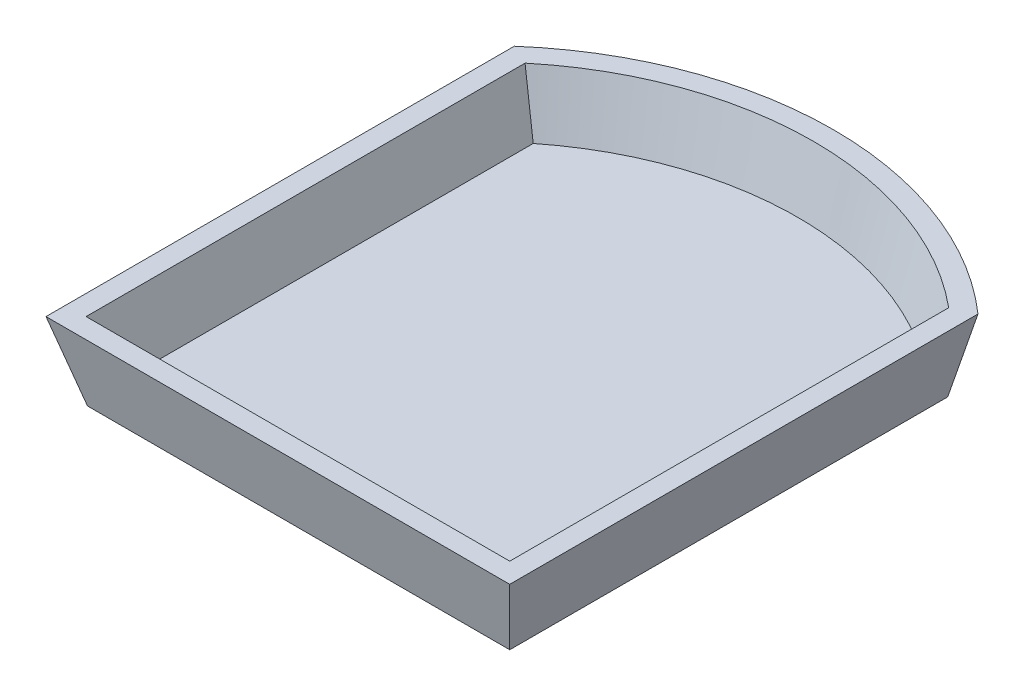
ISO-10303-21;
HEADER;
FILE_DESCRIPTION(('STEP AP214'),'2;1');
FILE_NAME('part.step','',(''),(''),'','','');
FILE_SCHEMA(('AUTOMOTIVE_DESIGN { 1 0 10303 214 1 1 1 1 }'));
ENDSEC;
DATA;
#1=APPLICATION_CONTEXT('core data for automotive mechanical design processes');
#2=APPLICATION_PROTOCOL_DEFINITION('international standard','automotive_design',2000,#1);
#3=PRODUCT_CONTEXT('',#1,'mechanical');
#4=PRODUCT('Part','Part','',(#3));
#5=PRODUCT_RELATED_PRODUCT_CATEGORY('part','',(#4));
#6=PRODUCT_DEFINITION_FORMATION('','',#4);
#7=PRODUCT_DEFINITION_CONTEXT('part definition',#1,'design');
#8=PRODUCT_DEFINITION('design','',#6,#7);
#9=PRODUCT_DEFINITION_SHAPE('','',#8);
#10=(LENGTH_UNIT() NAMED_UNIT(*) SI_UNIT(.MILLI.,.METRE.));
#11=(NAMED_UNIT(*) PLANE_ANGLE_UNIT() SI_UNIT($,.RADIAN.));
#12=(NAMED_UNIT(*) SI_UNIT($,.STERADIAN.) SOLID_ANGLE_UNIT());
#13=UNCERTAINTY_MEASURE_WITH_UNIT(LENGTH_MEASURE(1.E-05),#10,'distance_accuracy_value','');
#14=(GEOMETRIC_REPRESENTATION_CONTEXT(3) GLOBAL_UNCERTAINTY_ASSIGNED_CONTEXT((#13)) GLOBAL_UNIT_ASSIGNED_CONTEXT((#10,
#11,#12)) REPRESENTATION_CONTEXT('',''));
#15=CARTESIAN_POINT('',(0.,0.,0.));
#16=DIRECTION('',(0.,0.,1.));
#17=DIRECTION('',(1.,0.,0.));
#18=AXIS2_PLACEMENT_3D('',#15,#16,#17);
#19=CARTESIAN_POINT('',(0.,40.,18.4238959962177));
#20=DIRECTION('',(0.,-1.,0.));
#21=DIRECTION('',(0.,0.,-1.));
#22=AXIS2_PLACEMENT_3D('',#19,#20,#21);
#23=PLANE('',#22);
#24=CARTESIAN_POINT('',(0.,40.,18.4238959962177));
#25=DIRECTION('',(0.,-1.,0.));
#26=DIRECTION('',(0.,0.,-1.));
#27=AXIS2_PLACEMENT_3D('',#24,#25,#26);
#28=CIRCLE('',#27,181.543275446474);
#29=CARTESIAN_POINT('',(119.74782431008,40.,-118.02543318072));
#30=VERTEX_POINT('',#29);
#31=CARTESIAN_POINT('',(-119.74782431008,40.,-118.02543318072));
#32=VERTEX_POINT('',#31);
#33=EDGE_CURVE('E144',#30,#32,#28,.F.);
#34=ORIENTED_EDGE('',*,*,#33,.T.);
#35=DIRECTION('',(0.,0.,-1.));
#36=VECTOR('',#35,1.);
#37=CARTESIAN_POINT('',(-119.74782431008,40.,18.4238959962177));
#38=LINE('',#37,#36);
#39=CARTESIAN_POINT('',(-119.74782431008,40.,123.799874366169));
#40=VERTEX_POINT('',#39);
#41=EDGE_CURVE('E287',#32,#40,#38,.F.);
#42=ORIENTED_EDGE('',*,*,#41,.T.);
#43=DIRECTION('',(-1.,0.,0.));
#44=VECTOR('',#43,1.);
#45=CARTESIAN_POINT('',(0.,40.,123.799874366169));
#46=LINE('',#45,#44);
#47=CARTESIAN_POINT('',(119.74782431008,40.,123.799874366169));
#48=VERTEX_POINT('',#47);
#49=EDGE_CURVE('E281',#40,#48,#46,.F.);
#50=ORIENTED_EDGE('',*,*,#49,.T.);
#51=DIRECTION('',(0.,0.,1.));
#52=VECTOR('',#51,1.);
#53=CARTESIAN_POINT('',(119.74782431008,40.,18.4238959962177));
#54=LINE('',#53,#52);
#55=EDGE_CURVE('E39',#48,#30,#54,.F.);
#56=ORIENTED_EDGE('',*,*,#55,.T.);
#57=EDGE_LOOP('',(#34,#42,#50,#56));
#58=FACE_BOUND('',#57,.T.);
#59=CARTESIAN_POINT('',(0.,40.,18.4238959962177));
#60=DIRECTION('',(0.,-1.,0.));
#61=DIRECTION('',(0.,0.,-1.));
#62=AXIS2_PLACEMENT_3D('',#59,#60,#61);
#63=CIRCLE('',#62,171.190513642373);
#64=CARTESIAN_POINT('',(109.395062505979,40.,-113.253407516773));
#65=VERTEX_POINT('',#64);
#66=CARTESIAN_POINT('',(-109.395062505979,40.,-113.253407516773));
#67=VERTEX_POINT('',#66);
#68=EDGE_CURVE('E125',#65,#67,#63,.F.);
#69=ORIENTED_EDGE('',*,*,#68,.F.);
#70=DIRECTION('',(0.,0.,1.));
#71=VECTOR('',#70,1.);
#72=CARTESIAN_POINT('',(109.395062505979,40.,18.4238959962177));
#73=LINE('',#72,#71);
#74=CARTESIAN_POINT('',(109.395062505979,40.,113.447112562068));
#75=VERTEX_POINT('',#74);
#76=EDGE_CURVE('E134',#75,#65,#73,.F.);
#77=ORIENTED_EDGE('',*,*,#76,.F.);
#78=DIRECTION('',(-1.,0.,0.));
#79=VECTOR('',#78,1.);
#80=CARTESIAN_POINT('',(0.,40.,113.447112562068));
#81=LINE('',#80,#79);
#82=CARTESIAN_POINT('',(-109.395062505979,40.,113.447112562068));
#83=VERTEX_POINT('',#82);
#84=EDGE_CURVE('E132',#83,#75,#81,.F.);
#85=ORIENTED_EDGE('',*,*,#84,.F.);
#86=DIRECTION('',(0.,0.,-1.));
#87=VECTOR('',#86,1.);
#88=CARTESIAN_POINT('',(-109.395062505979,40.,18.4238959962177));
#89=LINE('',#88,#87);
#90=EDGE_CURVE('E117',#67,#83,#89,.F.);
#91=ORIENTED_EDGE('',*,*,#90,.F.);
#92=EDGE_LOOP('',(#69,#77,#85,#91));
#93=FACE_BOUND('',#92,.T.);
#94=ADVANCED_FACE('F35',(#58,#93),#23,.F.);
#95=CARTESIAN_POINT('',(0.,0.,18.4238959962177));
#96=DIRECTION('',(0.,1.,0.));
#97=DIRECTION('',(0.,0.,-1.));
#98=AXIS2_PLACEMENT_3D('',#95,#96,#97);
#99=CONICAL_SURFACE('',#98,170.825307749229,0.261799387799149);
#100=CARTESIAN_POINT('',(0.,0.,18.4238959962177));
#101=DIRECTION('',(0.,1.,0.));
#102=DIRECTION('',(0.,0.,-1.));
#103=AXIS2_PLACEMENT_3D('',#100,#101,#102);
#104=CIRCLE('',#103,170.825307749229);
#105=CARTESIAN_POINT('',(109.029856612835,0.,-113.081906668924));
#106=VERTEX_POINT('',#105);
#107=CARTESIAN_POINT('',(-109.029856612835,0.,-113.081906668924));
#108=VERTEX_POINT('',#107);
#109=EDGE_CURVE('E136',#106,#108,#104,.T.);
#110=ORIENTED_EDGE('',*,*,#109,.T.);
#111=CARTESIAN_POINT('',(-119.74782431008,40.,-118.02543318072));
#112=CARTESIAN_POINT('',(-118.854433826051,36.6658213226028,-117.620831947526));
#113=CARTESIAN_POINT('',(-117.961097126007,33.3318433697727,-117.214456930502));
#114=CARTESIAN_POINT('',(-116.174536386201,26.6643079180107,-116.398061519486));
#115=CARTESIAN_POINT('',(-115.281312346308,23.3307504185879,-115.988041129793));
#116=CARTESIAN_POINT('',(-113.494979834546,16.6640667254782,-115.164256174604));
#117=CARTESIAN_POINT('',(-112.601871362686,13.3309405318292,-114.75049160878));
#118=CARTESIAN_POINT('',(-110.81577339589,6.66513217244805,-113.919112671404));
#119=CARTESIAN_POINT('',(-109.922783901093,3.33245000724389,-113.501498295314));
#120=CARTESIAN_POINT('',(-109.029856612835,0.,-113.081906668924));
#121=B_SPLINE_CURVE_WITH_KNOTS('',3,(#111,#112,#113,#114,#115,#116,#117,#118,#119,#120),
.UNSPECIFIED.,.F.,.F.,(4,2,2,2,4),(0.,10.426282135138,20.8525519804202,31.2788227409457,
41.7051057915578),.UNSPECIFIED.);
#122=EDGE_CURVE('E11',#32,#108,#121,.T.);
#123=ORIENTED_EDGE('',*,*,#122,.F.);
#124=ORIENTED_EDGE('',*,*,#33,.F.);
#125=CARTESIAN_POINT('',(119.74782431008,40.,-118.02543318072));
#126=CARTESIAN_POINT('',(118.854433826051,36.6658213226028,-117.620831947526));
#127=CARTESIAN_POINT('',(117.961097126007,33.3318433697727,-117.214456930502));
#128=CARTESIAN_POINT('',(116.174536386201,26.6643079180107,-116.398061519486));
#129=CARTESIAN_POINT('',(115.281312346308,23.3307504185879,-115.988041129793));
#130=CARTESIAN_POINT('',(113.494979834546,16.6640667254782,-115.164256174604));
#131=CARTESIAN_POINT('',(112.601871362686,13.3309405318292,-114.75049160878));
#132=CARTESIAN_POINT('',(110.81577339589,6.66513217244805,-113.919112671404));
#133=CARTESIAN_POINT('',(109.922783901093,3.33245000724389,-113.501498295314));
#134=CARTESIAN_POINT('',(109.029856612835,0.,-113.081906668924));
#135=B_SPLINE_CURVE_WITH_KNOTS('',3,(#125,#126,#127,#128,#129,#130,#131,#132,#133,#134),
.UNSPECIFIED.,.F.,.F.,(4,2,2,2,4),(0.,10.426282135138,20.8525519804202,31.2788227409457,
41.7051057915578),.UNSPECIFIED.);
#136=EDGE_CURVE('E151',#30,#106,#135,.T.);
#137=ORIENTED_EDGE('',*,*,#136,.T.);
#138=EDGE_LOOP('',(#110,#123,#124,#137));
#139=FACE_BOUND('',#138,.T.);
#140=ADVANCED_FACE('F159',(#139),#99,.T.);
#141=CARTESIAN_POINT('',(-109.029856612835,0.,113.081906668924));
#142=DIRECTION('',(-0.965925826289068,-0.258819045102521,0.));
#143=DIRECTION('',(0.258819045102521,-0.965925826289068,0.));
#144=AXIS2_PLACEMENT_3D('',#141,#142,#143);
#145=PLANE('',#144);
#146=DIRECTION('',(0.,0.,1.));
#147=VECTOR('',#146,1.);
#148=CARTESIAN_POINT('',(-109.029856612835,0.,113.081906668924));
#149=LINE('',#148,#147);
#150=CARTESIAN_POINT('',(-109.029856612835,0.,113.081906668924));
#151=VERTEX_POINT('',#150);
#152=EDGE_CURVE('E139',#108,#151,#149,.T.);
#153=ORIENTED_EDGE('',*,*,#152,.T.);
#154=DIRECTION('',(0.250562807085732,-0.935113126531029,-0.250562807085732));
#155=VECTOR('',#154,1.);
#156=CARTESIAN_POINT('',(-109.029856612835,0.,113.081906668924));
#157=LINE('',#156,#155);
#158=EDGE_CURVE('E44',#40,#151,#157,.T.);
#159=ORIENTED_EDGE('',*,*,#158,.F.);
#160=ORIENTED_EDGE('',*,*,#41,.F.);
#161=ORIENTED_EDGE('',*,*,#122,.T.);
#162=EDGE_LOOP('',(#153,#159,#160,#161));
#163=FACE_BOUND('',#162,.T.);
#164=ADVANCED_FACE('F156',(#163),#145,.T.);
#165=CARTESIAN_POINT('',(-109.029856612835,0.,113.081906668924));
#166=DIRECTION('',(0.,-0.258819045102521,0.965925826289068));
#167=DIRECTION('',(0.,-0.965925826289068,-0.258819045102521));
#168=AXIS2_PLACEMENT_3D('',#165,#166,#167);
#169=PLANE('',#168);
#170=DIRECTION('',(1.,0.,0.));
#171=VECTOR('',#170,1.);
#172=CARTESIAN_POINT('',(-109.029856612835,0.,113.081906668924));
#173=LINE('',#172,#171);
#174=CARTESIAN_POINT('',(109.029856612835,0.,113.081906668924));
#175=VERTEX_POINT('',#174);
#176=EDGE_CURVE('E141',#151,#175,#173,.T.);
#177=ORIENTED_EDGE('',*,*,#176,.T.);
#178=DIRECTION('',(-0.250562807085732,-0.935113126531029,-0.250562807085732));
#179=VECTOR('',#178,1.);
#180=CARTESIAN_POINT('',(109.029856612835,0.,113.081906668924));
#181=LINE('',#180,#179);
#182=EDGE_CURVE('E282',#48,#175,#181,.T.);
#183=ORIENTED_EDGE('',*,*,#182,.F.);
#184=ORIENTED_EDGE('',*,*,#49,.F.);
#185=ORIENTED_EDGE('',*,*,#158,.T.);
#186=EDGE_LOOP('',(#177,#183,#184,#185));
#187=FACE_BOUND('',#186,.T.);
#188=ADVANCED_FACE('F37',(#187),#169,.T.);
#189=CARTESIAN_POINT('',(109.029856612835,0.,113.081906668924));
#190=DIRECTION('',(0.965925826289068,-0.258819045102521,0.));
#191=DIRECTION('',(0.258819045102521,0.965925826289068,0.));
#192=AXIS2_PLACEMENT_3D('',#189,#190,#191);
#193=PLANE('',#192);
#194=DIRECTION('',(0.,0.,-1.));
#195=VECTOR('',#194,1.);
#196=CARTESIAN_POINT('',(109.029856612835,0.,113.081906668924));
#197=LINE('',#196,#195);
#198=EDGE_CURVE('E143',#175,#106,#197,.T.);
#199=ORIENTED_EDGE('',*,*,#198,.T.);
#200=ORIENTED_EDGE('',*,*,#136,.F.);
#201=ORIENTED_EDGE('',*,*,#55,.F.);
#202=ORIENTED_EDGE('',*,*,#182,.T.);
#203=EDGE_LOOP('',(#199,#200,#201,#202));
#204=FACE_BOUND('',#203,.T.);
#205=ADVANCED_FACE('F163',(#204),#193,.T.);
#206=CARTESIAN_POINT('',(0.,0.,18.4238959962177));
#207=DIRECTION('',(0.,-1.,0.));
#208=DIRECTION('',(0.,0.,-1.));
#209=AXIS2_PLACEMENT_3D('',#206,#207,#208);
#210=PLANE('',#209);
#211=ORIENTED_EDGE('',*,*,#109,.F.);
#212=ORIENTED_EDGE('',*,*,#198,.F.);
#213=ORIENTED_EDGE('',*,*,#176,.F.);
#214=ORIENTED_EDGE('',*,*,#152,.F.);
#215=EDGE_LOOP('',(#211,#212,#213,#214));
#216=FACE_BOUND('',#215,.T.);
#217=ADVANCED_FACE('F167',(#216),#210,.T.);
#218=CARTESIAN_POINT('',(0.,2.58819045102521,18.4238959962177));
#219=DIRECTION('',(0.,1.,0.));
#220=DIRECTION('',(0.,0.,-1.));
#221=AXIS2_PLACEMENT_3D('',#218,#219,#220);
#222=CONICAL_SURFACE('',#221,161.166049486338,0.261799387799149);
#223=CARTESIAN_POINT('',(0.,10.,18.4238959962177));
#224=DIRECTION('',(0.,-1.,0.));
#225=DIRECTION('',(0.,0.,-1.));
#226=AXIS2_PLACEMENT_3D('',#223,#224,#225);
#227=CIRCLE('',#226,163.152037869439);
#228=CARTESIAN_POINT('',(101.356586733046,10.,-109.425350332329));
#229=VERTEX_POINT('',#228);
#230=CARTESIAN_POINT('',(-101.356586733046,10.,-109.425350332329));
#231=VERTEX_POINT('',#230);
#232=EDGE_CURVE('E108',#229,#231,#227,.F.);
#233=ORIENTED_EDGE('',*,*,#232,.F.);
#234=CARTESIAN_POINT('',(109.395062505979,40.,-113.253407516773));
#235=CARTESIAN_POINT('',(108.725044234346,37.4994577682647,-112.938971250744));
#236=CARTESIAN_POINT('',(108.055060825062,34.9990456445896,-112.623425649458));
#237=CARTESIAN_POINT('',(106.715166346495,29.998491373794,-111.990067139505));
#238=CARTESIAN_POINT('',(106.045255277153,27.4983492264587,-111.672254232656));
#239=CARTESIAN_POINT('',(104.705506987748,22.4983405410465,-111.034311955608));
#240=CARTESIAN_POINT('',(104.035669767689,19.9984740029828,-110.714182585298));
#241=CARTESIAN_POINT('',(102.696070889792,14.9990229289097,-110.071555532722));
#242=CARTESIAN_POINT('',(102.026309232016,12.4994383931282,-109.749057848558));
#243=CARTESIAN_POINT('',(101.356586733046,10.,-109.425350332329));
#244=B_SPLINE_CURVE_WITH_KNOTS('',3,(#234,#235,#236,#237,#238,#239,#240,#241,#242,#243),
.UNSPECIFIED.,.F.,.F.,(4,2,2,2,4),(0.,7.82333382755457,15.6466613829519,23.4699893082804,
31.2933235058258),.UNSPECIFIED.);
#245=EDGE_CURVE('E128',#65,#229,#244,.T.);
#246=ORIENTED_EDGE('',*,*,#245,.F.);
#247=ORIENTED_EDGE('',*,*,#68,.T.);
#248=CARTESIAN_POINT('',(-109.395062505979,40.,-113.253407516773));
#249=CARTESIAN_POINT('',(-108.725044234346,37.4994577682647,-112.938971250744));
#250=CARTESIAN_POINT('',(-108.055060825062,34.9990456445896,-112.623425649458));
#251=CARTESIAN_POINT('',(-106.715166346495,29.998491373794,-111.990067139505));
#252=CARTESIAN_POINT('',(-106.045255277153,27.4983492264587,-111.672254232656));
#253=CARTESIAN_POINT('',(-104.705506987748,22.4983405410465,-111.034311955608));
#254=CARTESIAN_POINT('',(-104.035669767689,19.9984740029828,-110.714182585298));
#255=CARTESIAN_POINT('',(-102.696070889792,14.9990229289097,-110.071555532722));
#256=CARTESIAN_POINT('',(-102.026309232016,12.4994383931282,-109.749057848558));
#257=CARTESIAN_POINT('',(-101.356586733046,10.,-109.425350332329));
#258=B_SPLINE_CURVE_WITH_KNOTS('',3,(#248,#249,#250,#251,#252,#253,#254,#255,#256,#257),
.UNSPECIFIED.,.F.,.F.,(4,2,2,2,4),(0.,7.82333382755457,15.6466613829519,23.4699893082804,
31.2933235058258),.UNSPECIFIED.);
#259=EDGE_CURVE('E120',#67,#231,#258,.T.);
#260=ORIENTED_EDGE('',*,*,#259,.T.);
#261=EDGE_LOOP('',(#233,#246,#247,#260));
#262=FACE_BOUND('',#261,.T.);
#263=ADVANCED_FACE('F173',(#262),#222,.F.);
#264=CARTESIAN_POINT('',(-99.3705983499447,2.58819045102521,113.081906668924));
#265=DIRECTION('',(-0.965925826289068,-0.258819045102521,0.));
#266=DIRECTION('',(0.258819045102521,-0.965925826289068,0.));
#267=AXIS2_PLACEMENT_3D('',#264,#265,#266);
#268=PLANE('',#267);
#269=DIRECTION('',(0.,0.,-1.));
#270=VECTOR('',#269,1.);
#271=CARTESIAN_POINT('',(-101.356586733046,10.,18.4238959962177));
#272=LINE('',#271,#270);
#273=CARTESIAN_POINT('',(-101.356586733046,10.,105.408636789135));
#274=VERTEX_POINT('',#273);
#275=EDGE_CURVE('E102',#231,#274,#272,.F.);
#276=ORIENTED_EDGE('',*,*,#275,.F.);
#277=ORIENTED_EDGE('',*,*,#259,.F.);
#278=ORIENTED_EDGE('',*,*,#90,.T.);
#279=DIRECTION('',(0.250562807085732,-0.935113126531029,-0.250562807085732));
#280=VECTOR('',#279,1.);
#281=CARTESIAN_POINT('',(-99.9770232004596,4.85139880411916,104.029073256548));
#282=LINE('',#281,#280);
#283=EDGE_CURVE('E114',#83,#274,#282,.T.);
#284=ORIENTED_EDGE('',*,*,#283,.T.);
#285=EDGE_LOOP('',(#276,#277,#278,#284));
#286=FACE_BOUND('',#285,.T.);
#287=ADVANCED_FACE('F115',(#286),#268,.F.);
#288=CARTESIAN_POINT('',(-109.029856612835,2.58819045102521,103.422648406033));
#289=DIRECTION('',(0.,-0.258819045102521,0.965925826289068));
#290=DIRECTION('',(0.,-0.965925826289068,-0.258819045102521));
#291=AXIS2_PLACEMENT_3D('',#288,#289,#290);
#292=PLANE('',#291);
#293=DIRECTION('',(-1.,0.,0.));
#294=VECTOR('',#293,1.);
#295=CARTESIAN_POINT('',(0.,10.,105.408636789135));
#296=LINE('',#295,#294);
#297=CARTESIAN_POINT('',(101.356586733046,10.,105.408636789135));
#298=VERTEX_POINT('',#297);
#299=EDGE_CURVE('E106',#274,#298,#296,.F.);
#300=ORIENTED_EDGE('',*,*,#299,.F.);
#301=ORIENTED_EDGE('',*,*,#283,.F.);
#302=ORIENTED_EDGE('',*,*,#84,.T.);
#303=DIRECTION('',(-0.250562807085732,-0.935113126531029,-0.250562807085732));
#304=VECTOR('',#303,1.);
#305=CARTESIAN_POINT('',(99.9770232004596,4.85139880411916,104.029073256548));
#306=LINE('',#305,#304);
#307=EDGE_CURVE('E52',#75,#298,#306,.T.);
#308=ORIENTED_EDGE('',*,*,#307,.T.);
#309=EDGE_LOOP('',(#300,#301,#302,#308));
#310=FACE_BOUND('',#309,.T.);
#311=ADVANCED_FACE('F122',(#310),#292,.F.);
#312=CARTESIAN_POINT('',(99.3705983499447,2.58819045102521,113.081906668924));
#313=DIRECTION('',(0.965925826289068,-0.258819045102521,0.));
#314=DIRECTION('',(0.258819045102521,0.965925826289068,0.));
#315=AXIS2_PLACEMENT_3D('',#312,#313,#314);
#316=PLANE('',#315);
#317=DIRECTION('',(0.,0.,1.));
#318=VECTOR('',#317,1.);
#319=CARTESIAN_POINT('',(101.356586733046,10.,18.4238959962177));
#320=LINE('',#319,#318);
#321=EDGE_CURVE('E123',#298,#229,#320,.F.);
#322=ORIENTED_EDGE('',*,*,#321,.F.);
#323=ORIENTED_EDGE('',*,*,#307,.F.);
#324=ORIENTED_EDGE('',*,*,#76,.T.);
#325=ORIENTED_EDGE('',*,*,#245,.T.);
#326=EDGE_LOOP('',(#322,#323,#324,#325));
#327=FACE_BOUND('',#326,.T.);
#328=ADVANCED_FACE('F184',(#327),#316,.F.);
#329=CARTESIAN_POINT('',(0.,10.,18.4238959962177));
#330=DIRECTION('',(0.,-1.,0.));
#331=DIRECTION('',(0.,0.,-1.));
#332=AXIS2_PLACEMENT_3D('',#329,#330,#331);
#333=PLANE('',#332);
#334=ORIENTED_EDGE('',*,*,#232,.T.);
#335=ORIENTED_EDGE('',*,*,#275,.T.);
#336=ORIENTED_EDGE('',*,*,#299,.T.);
#337=ORIENTED_EDGE('',*,*,#321,.T.);
#338=EDGE_LOOP('',(#334,#335,#336,#337));
#339=FACE_BOUND('',#338,.T.);
#340=ADVANCED_FACE('F104',(#339),#333,.F.);
#341=CLOSED_SHELL('',(#94,#140,#164,#188,#205,#217,#263,#287,#311,#328,#340));
#342=MANIFOLD_SOLID_BREP('B2',#341);
#343=ADVANCED_BREP_SHAPE_REPRESENTATION('',(#18,#342),#14);
#344=SHAPE_DEFINITION_REPRESENTATION(#9,#343);
ENDSEC;
END-ISO-10303-21;
